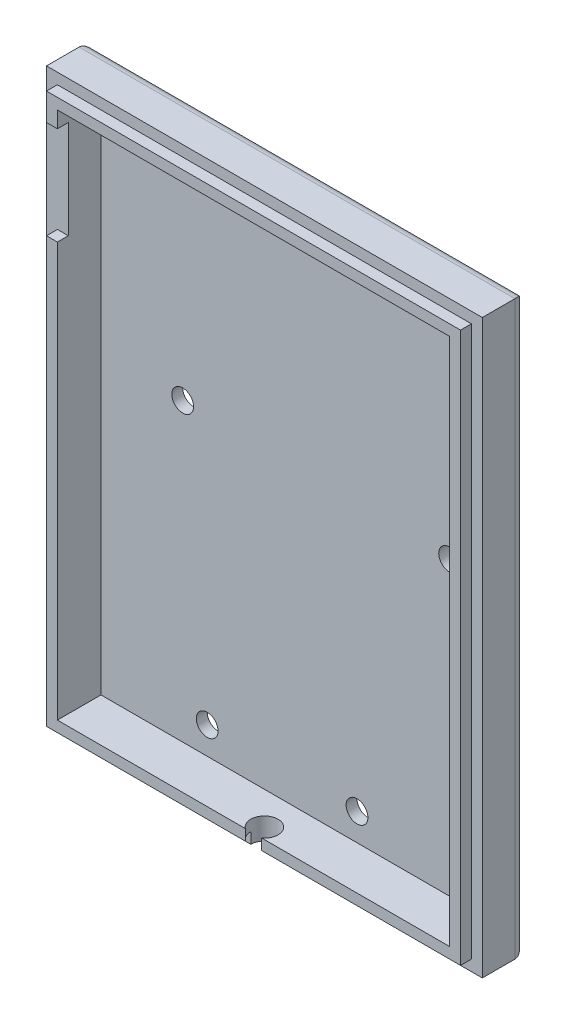
ISO-10303-21;
HEADER;
FILE_DESCRIPTION(('STEP AP214'),'2;1');
FILE_NAME('part.step','',(''),(''),'','','');
FILE_SCHEMA(('AUTOMOTIVE_DESIGN { 1 0 10303 214 1 1 1 1 }'));
ENDSEC;
DATA;
#1=APPLICATION_CONTEXT('core data for automotive mechanical design processes');
#2=APPLICATION_PROTOCOL_DEFINITION('international standard','automotive_design',2000,#1);
#3=PRODUCT_CONTEXT('',#1,'mechanical');
#4=PRODUCT('Part','Part','',(#3));
#5=PRODUCT_RELATED_PRODUCT_CATEGORY('part','',(#4));
#6=PRODUCT_DEFINITION_FORMATION('','',#4);
#7=PRODUCT_DEFINITION_CONTEXT('part definition',#1,'design');
#8=PRODUCT_DEFINITION('design','',#6,#7);
#9=PRODUCT_DEFINITION_SHAPE('','',#8);
#10=(LENGTH_UNIT() NAMED_UNIT(*) SI_UNIT(.MILLI.,.METRE.));
#11=(NAMED_UNIT(*) PLANE_ANGLE_UNIT() SI_UNIT($,.RADIAN.));
#12=(NAMED_UNIT(*) SI_UNIT($,.STERADIAN.) SOLID_ANGLE_UNIT());
#13=UNCERTAINTY_MEASURE_WITH_UNIT(LENGTH_MEASURE(1.E-05),#10,'distance_accuracy_value','');
#14=(GEOMETRIC_REPRESENTATION_CONTEXT(3) GLOBAL_UNCERTAINTY_ASSIGNED_CONTEXT((#13)) GLOBAL_UNIT_ASSIGNED_CONTEXT((#10,
#11,#12)) REPRESENTATION_CONTEXT('',''));
#15=CARTESIAN_POINT('',(0.,0.,0.));
#16=DIRECTION('',(0.,0.,1.));
#17=DIRECTION('',(1.,0.,0.));
#18=AXIS2_PLACEMENT_3D('',#15,#16,#17);
#19=CARTESIAN_POINT('',(-3.00000000000004,36.5344827586207,10.));
#20=DIRECTION('',(1.,0.,0.));
#21=DIRECTION('',(0.,1.,0.));
#22=AXIS2_PLACEMENT_3D('',#19,#20,#21);
#23=PLANE('',#22);
#24=DIRECTION('',(0.,-1.,0.));
#25=VECTOR('',#24,1.);
#26=CARTESIAN_POINT('',(-3.00000000000004,36.5344827586207,8.));
#27=LINE('',#26,#25);
#28=CARTESIAN_POINT('',(-3.00000000000004,36.5344827586207,8.));
#29=VERTEX_POINT('',#28);
#30=CARTESIAN_POINT('',(-3.00000000000004,31.5344827586207,8.));
#31=VERTEX_POINT('',#30);
#32=EDGE_CURVE('E215',#29,#31,#27,.T.);
#33=ORIENTED_EDGE('',*,*,#32,.T.);
#34=DIRECTION('',(0.,0.,1.));
#35=VECTOR('',#34,1.);
#36=CARTESIAN_POINT('',(-3.00000000000004,31.5344827586207,8.));
#37=LINE('',#36,#35);
#38=CARTESIAN_POINT('',(-3.00000000000004,31.5344827586207,10.));
#39=VERTEX_POINT('',#38);
#40=EDGE_CURVE('E374',#31,#39,#37,.T.);
#41=ORIENTED_EDGE('',*,*,#40,.T.);
#42=DIRECTION('',(0.,-1.,0.));
#43=VECTOR('',#42,1.);
#44=CARTESIAN_POINT('',(-3.00000000000004,36.5344827586207,10.));
#45=LINE('',#44,#43);
#46=CARTESIAN_POINT('',(-3.00000000000004,36.5344827586207,10.));
#47=VERTEX_POINT('',#46);
#48=EDGE_CURVE('E424',#47,#39,#45,.T.);
#49=ORIENTED_EDGE('',*,*,#48,.F.);
#50=DIRECTION('',(0.,0.,-1.));
#51=VECTOR('',#50,1.);
#52=CARTESIAN_POINT('',(-3.00000000000004,36.5344827586207,10.));
#53=LINE('',#52,#51);
#54=EDGE_CURVE('E238',#47,#29,#53,.T.);
#55=ORIENTED_EDGE('',*,*,#54,.T.);
#56=EDGE_LOOP('',(#33,#41,#49,#55));
#57=FACE_BOUND('',#56,.T.);
#58=ADVANCED_FACE('F39',(#57),#23,.F.);
#59=CARTESIAN_POINT('',(0.,0.,10.));
#60=DIRECTION('',(0.,0.,1.));
#61=DIRECTION('',(1.,0.,0.));
#62=AXIS2_PLACEMENT_3D('',#59,#60,#61);
#63=PLANE('',#62);
#64=DIRECTION('',(-1.,0.,0.));
#65=VECTOR('',#64,1.);
#66=CARTESIAN_POINT('',(-3.00000000000004,31.5344827586207,10.));
#67=LINE('',#66,#65);
#68=CARTESIAN_POINT('',(-1.00000000000004,31.5344827586207,10.));
#69=VERTEX_POINT('',#68);
#70=EDGE_CURVE('E197',#69,#39,#67,.T.);
#71=ORIENTED_EDGE('',*,*,#70,.F.);
#72=DIRECTION('',(0.,-1.,0.));
#73=VECTOR('',#72,1.);
#74=CARTESIAN_POINT('',(-1.00000000000004,34.5344827586207,10.));
#75=LINE('',#74,#73);
#76=CARTESIAN_POINT('',(-1.00000000000004,34.5344827586207,10.));
#77=VERTEX_POINT('',#76);
#78=EDGE_CURVE('E216',#77,#69,#75,.T.);
#79=ORIENTED_EDGE('',*,*,#78,.F.);
#80=DIRECTION('',(1.,0.,0.));
#81=VECTOR('',#80,1.);
#82=CARTESIAN_POINT('',(-1.00000000000004,34.5344827586207,10.));
#83=LINE('',#82,#81);
#84=CARTESIAN_POINT('',(71.,34.5344827586207,10.));
#85=VERTEX_POINT('',#84);
#86=EDGE_CURVE('E420',#77,#85,#83,.T.);
#87=ORIENTED_EDGE('',*,*,#86,.T.);
#88=DIRECTION('',(0.,-1.,0.));
#89=VECTOR('',#88,1.);
#90=CARTESIAN_POINT('',(71.,34.5344827586207,10.));
#91=LINE('',#90,#89);
#92=CARTESIAN_POINT('',(71.,-62.4655172413793,10.));
#93=VERTEX_POINT('',#92);
#94=EDGE_CURVE('E416',#85,#93,#91,.T.);
#95=ORIENTED_EDGE('',*,*,#94,.T.);
#96=DIRECTION('',(1.,0.,0.));
#97=VECTOR('',#96,1.);
#98=CARTESIAN_POINT('',(-1.00000000000003,-62.4655172413793,10.));
#99=LINE('',#98,#97);
#100=CARTESIAN_POINT('',(36.5,-62.4655172413793,10.));
#101=VERTEX_POINT('',#100);
#102=EDGE_CURVE('E411',#101,#93,#99,.T.);
#103=ORIENTED_EDGE('',*,*,#102,.F.);
#104=DIRECTION('',(0.,-1.,0.));
#105=VECTOR('',#104,1.);
#106=CARTESIAN_POINT('',(36.5,-61.4655172413793,10.));
#107=LINE('',#106,#105);
#108=CARTESIAN_POINT('',(36.5,-64.4655172413793,10.));
#109=VERTEX_POINT('',#108);
#110=EDGE_CURVE('E339',#109,#101,#107,.F.);
#111=ORIENTED_EDGE('',*,*,#110,.F.);
#112=DIRECTION('',(1.,0.,0.));
#113=VECTOR('',#112,1.);
#114=CARTESIAN_POINT('',(-3.00000000000003,-64.4655172413793,10.));
#115=LINE('',#114,#113);
#116=CARTESIAN_POINT('',(73.,-64.4655172413793,10.));
#117=VERTEX_POINT('',#116);
#118=EDGE_CURVE('E428',#109,#117,#115,.T.);
#119=ORIENTED_EDGE('',*,*,#118,.T.);
#120=DIRECTION('',(0.,1.,0.));
#121=VECTOR('',#120,1.);
#122=CARTESIAN_POINT('',(73.,36.5344827586207,10.));
#123=LINE('',#122,#121);
#124=CARTESIAN_POINT('',(73.,36.5344827586207,10.));
#125=VERTEX_POINT('',#124);
#126=EDGE_CURVE('E432',#117,#125,#123,.T.);
#127=ORIENTED_EDGE('',*,*,#126,.T.);
#128=DIRECTION('',(-1.,0.,0.));
#129=VECTOR('',#128,1.);
#130=CARTESIAN_POINT('',(-3.00000000000004,36.5344827586207,10.));
#131=LINE('',#130,#129);
#132=EDGE_CURVE('E227',#125,#47,#131,.T.);
#133=ORIENTED_EDGE('',*,*,#132,.T.);
#134=ORIENTED_EDGE('',*,*,#48,.T.);
#135=EDGE_LOOP('',(#71,#79,#87,#95,#103,#111,#119,#127,#133,#134));
#136=FACE_BOUND('',#135,.T.);
#137=ADVANCED_FACE('F441',(#136),#63,.T.);
#138=CARTESIAN_POINT('',(-3.00000000000003,-64.4655172413793,10.));
#139=DIRECTION('',(0.,1.,0.));
#140=DIRECTION('',(0.,0.,1.));
#141=AXIS2_PLACEMENT_3D('',#138,#139,#140);
#142=PLANE('',#141);
#143=ORIENTED_EDGE('',*,*,#118,.F.);
#144=CARTESIAN_POINT('',(35.,-64.4655172413793,8.));
#145=DIRECTION('',(0.,1.,0.));
#146=DIRECTION('',(0.,0.,1.));
#147=AXIS2_PLACEMENT_3D('',#144,#145,#146);
#148=CIRCLE('',#147,2.5);
#149=CARTESIAN_POINT('',(37.5,-64.4655172413793,8.));
#150=VERTEX_POINT('',#149);
#151=EDGE_CURVE('E390',#109,#150,#148,.T.);
#152=ORIENTED_EDGE('',*,*,#151,.T.);
#153=DIRECTION('',(1.,0.,0.));
#154=VECTOR('',#153,1.);
#155=CARTESIAN_POINT('',(-3.00000000000003,-64.4655172413793,8.));
#156=LINE('',#155,#154);
#157=CARTESIAN_POINT('',(73.,-64.4655172413793,8.));
#158=VERTEX_POINT('',#157);
#159=EDGE_CURVE('E221',#150,#158,#156,.T.);
#160=ORIENTED_EDGE('',*,*,#159,.T.);
#161=DIRECTION('',(0.,0.,-1.));
#162=VECTOR('',#161,1.);
#163=CARTESIAN_POINT('',(73.,-64.4655172413793,10.));
#164=LINE('',#163,#162);
#165=EDGE_CURVE('E245',#117,#158,#164,.T.);
#166=ORIENTED_EDGE('',*,*,#165,.F.);
#167=EDGE_LOOP('',(#143,#152,#160,#166));
#168=FACE_BOUND('',#167,.T.);
#169=ADVANCED_FACE('F483',(#168),#142,.F.);
#170=CARTESIAN_POINT('',(0.,0.,8.));
#171=DIRECTION('',(0.,0.,1.));
#172=DIRECTION('',(1.,0.,0.));
#173=AXIS2_PLACEMENT_3D('',#170,#171,#172);
#174=PLANE('',#173);
#175=DIRECTION('',(0.,-1.,0.));
#176=VECTOR('',#175,1.);
#177=CARTESIAN_POINT('',(32.5,-61.4655172413793,8.));
#178=LINE('',#177,#176);
#179=CARTESIAN_POINT('',(32.5,-64.4655172413793,8.));
#180=VERTEX_POINT('',#179);
#181=CARTESIAN_POINT('',(32.5,-66.4655172413793,8.));
#182=VERTEX_POINT('',#181);
#183=EDGE_CURVE('E408',#180,#182,#178,.T.);
#184=ORIENTED_EDGE('',*,*,#183,.F.);
#185=CARTESIAN_POINT('',(-3.00000000000003,-64.4655172413793,8.));
#186=VERTEX_POINT('',#185);
#187=EDGE_CURVE('E213',#186,#180,#156,.T.);
#188=ORIENTED_EDGE('',*,*,#187,.F.);
#189=CARTESIAN_POINT('',(-3.00000000000004,13.5344827586207,8.));
#190=VERTEX_POINT('',#189);
#191=EDGE_CURVE('E203',#190,#186,#27,.T.);
#192=ORIENTED_EDGE('',*,*,#191,.F.);
#193=DIRECTION('',(1.,0.,0.));
#194=VECTOR('',#193,1.);
#195=CARTESIAN_POINT('',(-3.00000000000004,13.5344827586207,8.));
#196=LINE('',#195,#194);
#197=CARTESIAN_POINT('',(-1.00000000000004,13.5344827586207,8.));
#198=VERTEX_POINT('',#197);
#199=EDGE_CURVE('E188',#190,#198,#196,.T.);
#200=ORIENTED_EDGE('',*,*,#199,.T.);
#201=DIRECTION('',(0.,1.,0.));
#202=VECTOR('',#201,1.);
#203=CARTESIAN_POINT('',(-1.00000000000004,31.5344827586207,8.));
#204=LINE('',#203,#202);
#205=CARTESIAN_POINT('',(-1.00000000000004,31.5344827586207,8.));
#206=VERTEX_POINT('',#205);
#207=EDGE_CURVE('E196',#198,#206,#204,.T.);
#208=ORIENTED_EDGE('',*,*,#207,.T.);
#209=DIRECTION('',(-1.,0.,0.));
#210=VECTOR('',#209,1.);
#211=CARTESIAN_POINT('',(-3.00000000000004,31.5344827586207,8.));
#212=LINE('',#211,#210);
#213=EDGE_CURVE('E207',#206,#31,#212,.T.);
#214=ORIENTED_EDGE('',*,*,#213,.T.);
#215=ORIENTED_EDGE('',*,*,#32,.F.);
#216=DIRECTION('',(-1.,0.,0.));
#217=VECTOR('',#216,1.);
#218=CARTESIAN_POINT('',(-3.00000000000004,36.5344827586207,8.));
#219=LINE('',#218,#217);
#220=CARTESIAN_POINT('',(73.,36.5344827586207,8.));
#221=VERTEX_POINT('',#220);
#222=EDGE_CURVE('E235',#221,#29,#219,.T.);
#223=ORIENTED_EDGE('',*,*,#222,.F.);
#224=DIRECTION('',(0.,1.,0.));
#225=VECTOR('',#224,1.);
#226=CARTESIAN_POINT('',(73.,36.5344827586207,8.));
#227=LINE('',#226,#225);
#228=EDGE_CURVE('E231',#158,#221,#227,.T.);
#229=ORIENTED_EDGE('',*,*,#228,.F.);
#230=ORIENTED_EDGE('',*,*,#159,.F.);
#231=DIRECTION('',(0.,-1.,0.));
#232=VECTOR('',#231,1.);
#233=CARTESIAN_POINT('',(37.5,-61.4655172413793,8.));
#234=LINE('',#233,#232);
#235=CARTESIAN_POINT('',(37.5,-66.4655172413793,8.));
#236=VERTEX_POINT('',#235);
#237=EDGE_CURVE('E405',#236,#150,#234,.F.);
#238=ORIENTED_EDGE('',*,*,#237,.F.);
#239=DIRECTION('',(1.,0.,0.));
#240=VECTOR('',#239,1.);
#241=CARTESIAN_POINT('',(0.,-66.4655172413793,8.));
#242=LINE('',#241,#240);
#243=CARTESIAN_POINT('',(75.,-66.4655172413793,8.));
#244=VERTEX_POINT('',#243);
#245=EDGE_CURVE('E306',#236,#244,#242,.T.);
#246=ORIENTED_EDGE('',*,*,#245,.T.);
#247=DIRECTION('',(0.,-1.,0.));
#248=VECTOR('',#247,1.);
#249=CARTESIAN_POINT('',(75.,0.,8.));
#250=LINE('',#249,#248);
#251=CARTESIAN_POINT('',(75.,38.5344827586207,8.));
#252=VERTEX_POINT('',#251);
#253=EDGE_CURVE('E294',#252,#244,#250,.T.);
#254=ORIENTED_EDGE('',*,*,#253,.F.);
#255=DIRECTION('',(1.,0.,0.));
#256=VECTOR('',#255,1.);
#257=CARTESIAN_POINT('',(0.,38.5344827586207,8.));
#258=LINE('',#257,#256);
#259=CARTESIAN_POINT('',(-5.00000000000004,38.5344827586207,8.));
#260=VERTEX_POINT('',#259);
#261=EDGE_CURVE('E298',#260,#252,#258,.T.);
#262=ORIENTED_EDGE('',*,*,#261,.F.);
#263=DIRECTION('',(0.,-1.,0.));
#264=VECTOR('',#263,1.);
#265=CARTESIAN_POINT('',(-5.00000000000004,0.,8.));
#266=LINE('',#265,#264);
#267=CARTESIAN_POINT('',(-5.00000000000003,-66.4655172413793,8.));
#268=VERTEX_POINT('',#267);
#269=EDGE_CURVE('E303',#260,#268,#266,.T.);
#270=ORIENTED_EDGE('',*,*,#269,.T.);
#271=EDGE_CURVE('E307',#268,#182,#242,.T.);
#272=ORIENTED_EDGE('',*,*,#271,.T.);
#273=EDGE_LOOP('',(#184,#188,#192,#200,#208,#214,#215,#223,#229,#230,#238,#246,#254,#262,#270,#272));
#274=FACE_BOUND('',#273,.T.);
#275=ADVANCED_FACE('F211',(#274),#174,.T.);
#276=CARTESIAN_POINT('',(75.,0.,8.));
#277=DIRECTION('',(1.,0.,0.));
#278=DIRECTION('',(0.,0.,-1.));
#279=AXIS2_PLACEMENT_3D('',#276,#277,#278);
#280=PLANE('',#279);
#281=DIRECTION('',(0.,0.,-1.));
#282=VECTOR('',#281,1.);
#283=CARTESIAN_POINT('',(75.,-66.4655172413793,8.));
#284=LINE('',#283,#282);
#285=CARTESIAN_POINT('',(75.,-66.4655172413793,2.));
#286=VERTEX_POINT('',#285);
#287=EDGE_CURVE('E311',#244,#286,#284,.T.);
#288=ORIENTED_EDGE('',*,*,#287,.T.);
#289=DIRECTION('',(0.,-1.,0.));
#290=VECTOR('',#289,1.);
#291=CARTESIAN_POINT('',(75.,38.5344827586207,2.));
#292=LINE('',#291,#290);
#293=CARTESIAN_POINT('',(75.,38.5344827586207,2.));
#294=VERTEX_POINT('',#293);
#295=EDGE_CURVE('E11',#286,#294,#292,.F.);
#296=ORIENTED_EDGE('',*,*,#295,.T.);
#297=DIRECTION('',(0.,0.,-1.));
#298=VECTOR('',#297,1.);
#299=CARTESIAN_POINT('',(75.,38.5344827586207,8.));
#300=LINE('',#299,#298);
#301=EDGE_CURVE('E336',#252,#294,#300,.T.);
#302=ORIENTED_EDGE('',*,*,#301,.F.);
#303=ORIENTED_EDGE('',*,*,#253,.T.);
#304=EDGE_LOOP('',(#288,#296,#302,#303));
#305=FACE_BOUND('',#304,.T.);
#306=ADVANCED_FACE('F556',(#305),#280,.T.);
#307=CARTESIAN_POINT('',(0.,38.5344827586207,8.));
#308=DIRECTION('',(0.,1.,0.));
#309=DIRECTION('',(0.,0.,1.));
#310=AXIS2_PLACEMENT_3D('',#307,#308,#309);
#311=PLANE('',#310);
#312=ORIENTED_EDGE('',*,*,#301,.T.);
#313=DIRECTION('',(1.,0.,0.));
#314=VECTOR('',#313,1.);
#315=CARTESIAN_POINT('',(-5.00000000000004,38.5344827586207,2.));
#316=LINE('',#315,#314);
#317=CARTESIAN_POINT('',(-5.00000000000004,38.5344827586207,2.));
#318=VERTEX_POINT('',#317);
#319=EDGE_CURVE('E49',#294,#318,#316,.F.);
#320=ORIENTED_EDGE('',*,*,#319,.T.);
#321=DIRECTION('',(0.,0.,-1.));
#322=VECTOR('',#321,1.);
#323=CARTESIAN_POINT('',(-5.00000000000004,38.5344827586207,8.));
#324=LINE('',#323,#322);
#325=EDGE_CURVE('E332',#260,#318,#324,.T.);
#326=ORIENTED_EDGE('',*,*,#325,.F.);
#327=ORIENTED_EDGE('',*,*,#261,.T.);
#328=EDGE_LOOP('',(#312,#320,#326,#327));
#329=FACE_BOUND('',#328,.T.);
#330=ADVANCED_FACE('F586',(#329),#311,.T.);
#331=CARTESIAN_POINT('',(-5.00000000000004,0.,8.));
#332=DIRECTION('',(1.,0.,0.));
#333=DIRECTION('',(0.,1.,0.));
#334=AXIS2_PLACEMENT_3D('',#331,#332,#333);
#335=PLANE('',#334);
#336=ORIENTED_EDGE('',*,*,#325,.T.);
#337=DIRECTION('',(0.,-1.,0.));
#338=VECTOR('',#337,1.);
#339=CARTESIAN_POINT('',(-5.00000000000004,0.,2.));
#340=LINE('',#339,#338);
#341=CARTESIAN_POINT('',(-5.00000000000003,-66.4655172413793,2.));
#342=VERTEX_POINT('',#341);
#343=EDGE_CURVE('E365',#318,#342,#340,.T.);
#344=ORIENTED_EDGE('',*,*,#343,.T.);
#345=DIRECTION('',(0.,0.,-1.));
#346=VECTOR('',#345,1.);
#347=CARTESIAN_POINT('',(-5.00000000000003,-66.4655172413793,8.));
#348=LINE('',#347,#346);
#349=EDGE_CURVE('E328',#268,#342,#348,.T.);
#350=ORIENTED_EDGE('',*,*,#349,.F.);
#351=ORIENTED_EDGE('',*,*,#269,.F.);
#352=EDGE_LOOP('',(#336,#344,#350,#351));
#353=FACE_BOUND('',#352,.T.);
#354=ADVANCED_FACE('F576',(#353),#335,.F.);
#355=CARTESIAN_POINT('',(46.,-57.4655172413793,8.));
#356=DIRECTION('',(0.,0.,-1.));
#357=DIRECTION('',(-1.,0.,0.));
#358=AXIS2_PLACEMENT_3D('',#355,#356,#357);
#359=CYLINDRICAL_SURFACE('',#358,2.);
#360=CARTESIAN_POINT('',(46.,-57.4655172413793,2.));
#361=DIRECTION('',(0.,0.,-1.));
#362=DIRECTION('',(-1.,0.,0.));
#363=AXIS2_PLACEMENT_3D('',#360,#361,#362);
#364=CIRCLE('',#363,2.);
#365=CARTESIAN_POINT('',(44.,-57.4655172413793,2.));
#366=VERTEX_POINT('',#365);
#367=EDGE_CURVE('E289',#366,#366,#364,.T.);
#368=ORIENTED_EDGE('',*,*,#367,.F.);
#369=EDGE_LOOP('',(#368));
#370=FACE_BOUND('',#369,.T.);
#371=CARTESIAN_POINT('',(46.,-57.4655172413793,0.));
#372=DIRECTION('',(0.,0.,1.));
#373=DIRECTION('',(1.,0.,0.));
#374=AXIS2_PLACEMENT_3D('',#371,#372,#373);
#375=CIRCLE('',#374,2.);
#376=CARTESIAN_POINT('',(48.,-57.4655172413793,0.));
#377=VERTEX_POINT('',#376);
#378=EDGE_CURVE('E319',#377,#377,#375,.T.);
#379=ORIENTED_EDGE('',*,*,#378,.F.);
#380=EDGE_LOOP('',(#379));
#381=FACE_BOUND('',#380,.T.);
#382=ADVANCED_FACE('F605',(#370,#381),#359,.F.);
#383=CARTESIAN_POINT('',(18.5,-57.4655172413793,8.));
#384=DIRECTION('',(0.,0.,-1.));
#385=DIRECTION('',(-1.,0.,0.));
#386=AXIS2_PLACEMENT_3D('',#383,#384,#385);
#387=CYLINDRICAL_SURFACE('',#386,2.);
#388=CARTESIAN_POINT('',(18.5,-57.4655172413793,2.));
#389=DIRECTION('',(0.,0.,-1.));
#390=DIRECTION('',(-1.,0.,0.));
#391=AXIS2_PLACEMENT_3D('',#388,#389,#390);
#392=CIRCLE('',#391,2.);
#393=CARTESIAN_POINT('',(16.5,-57.4655172413793,2.));
#394=VERTEX_POINT('',#393);
#395=EDGE_CURVE('E285',#394,#394,#392,.T.);
#396=ORIENTED_EDGE('',*,*,#395,.F.);
#397=EDGE_LOOP('',(#396));
#398=FACE_BOUND('',#397,.T.);
#399=CARTESIAN_POINT('',(18.5,-57.4655172413793,0.));
#400=DIRECTION('',(0.,0.,1.));
#401=DIRECTION('',(1.,0.,0.));
#402=AXIS2_PLACEMENT_3D('',#399,#400,#401);
#403=CIRCLE('',#402,2.);
#404=CARTESIAN_POINT('',(20.5,-57.4655172413793,0.));
#405=VERTEX_POINT('',#404);
#406=EDGE_CURVE('E315',#405,#405,#403,.T.);
#407=ORIENTED_EDGE('',*,*,#406,.F.);
#408=EDGE_LOOP('',(#407));
#409=FACE_BOUND('',#408,.T.);
#410=ADVANCED_FACE('F608',(#398,#409),#387,.F.);
#411=CARTESIAN_POINT('',(14.,-8.15057708828791,8.));
#412=DIRECTION('',(0.,0.,-1.));
#413=DIRECTION('',(-1.,0.,0.));
#414=AXIS2_PLACEMENT_3D('',#411,#412,#413);
#415=CYLINDRICAL_SURFACE('',#414,2.);
#416=CARTESIAN_POINT('',(14.,-8.15057708828791,2.));
#417=DIRECTION('',(0.,0.,-1.));
#418=DIRECTION('',(-1.,0.,0.));
#419=AXIS2_PLACEMENT_3D('',#416,#417,#418);
#420=CIRCLE('',#419,2.);
#421=CARTESIAN_POINT('',(12.,-8.15057708828791,2.));
#422=VERTEX_POINT('',#421);
#423=EDGE_CURVE('E281',#422,#422,#420,.T.);
#424=ORIENTED_EDGE('',*,*,#423,.F.);
#425=EDGE_LOOP('',(#424));
#426=FACE_BOUND('',#425,.T.);
#427=CARTESIAN_POINT('',(14.,-8.15057708828791,0.));
#428=DIRECTION('',(0.,0.,1.));
#429=DIRECTION('',(1.,0.,0.));
#430=AXIS2_PLACEMENT_3D('',#427,#428,#429);
#431=CIRCLE('',#430,2.);
#432=CARTESIAN_POINT('',(16.,-8.15057708828791,0.));
#433=VERTEX_POINT('',#432);
#434=EDGE_CURVE('E293',#433,#433,#431,.T.);
#435=ORIENTED_EDGE('',*,*,#434,.F.);
#436=EDGE_LOOP('',(#435));
#437=FACE_BOUND('',#436,.T.);
#438=ADVANCED_FACE('F612',(#426,#437),#415,.F.);
#439=CARTESIAN_POINT('',(0.,-66.4655172413793,8.));
#440=DIRECTION('',(0.,1.,0.));
#441=DIRECTION('',(0.,0.,1.));
#442=AXIS2_PLACEMENT_3D('',#439,#440,#441);
#443=PLANE('',#442);
#444=ORIENTED_EDGE('',*,*,#349,.T.);
#445=DIRECTION('',(1.,0.,0.));
#446=VECTOR('',#445,1.);
#447=CARTESIAN_POINT('',(0.,-66.4655172413793,2.));
#448=LINE('',#447,#446);
#449=EDGE_CURVE('E348',#342,#286,#448,.T.);
#450=ORIENTED_EDGE('',*,*,#449,.T.);
#451=ORIENTED_EDGE('',*,*,#287,.F.);
#452=ORIENTED_EDGE('',*,*,#245,.F.);
#453=CARTESIAN_POINT('',(35.,-66.4655172413793,8.));
#454=DIRECTION('',(0.,-1.,0.));
#455=DIRECTION('',(0.,0.,-1.));
#456=AXIS2_PLACEMENT_3D('',#453,#454,#455);
#457=CIRCLE('',#456,2.5);
#458=EDGE_CURVE('E384',#182,#236,#457,.T.);
#459=ORIENTED_EDGE('',*,*,#458,.F.);
#460=ORIENTED_EDGE('',*,*,#271,.F.);
#461=EDGE_LOOP('',(#444,#450,#451,#452,#459,#460));
#462=FACE_BOUND('',#461,.T.);
#463=ADVANCED_FACE('F580',(#462),#443,.F.);
#464=CARTESIAN_POINT('',(62.9999999999999,-8.95057708828791,8.));
#465=DIRECTION('',(0.,0.,-1.));
#466=DIRECTION('',(-1.,0.,0.));
#467=AXIS2_PLACEMENT_3D('',#464,#465,#466);
#468=CYLINDRICAL_SURFACE('',#467,2.);
#469=CARTESIAN_POINT('',(62.9999999999999,-8.95057708828791,2.));
#470=DIRECTION('',(0.,0.,-1.));
#471=DIRECTION('',(-1.,0.,0.));
#472=AXIS2_PLACEMENT_3D('',#469,#470,#471);
#473=CIRCLE('',#472,2.);
#474=CARTESIAN_POINT('',(61.,-8.95057708828791,2.));
#475=VERTEX_POINT('',#474);
#476=EDGE_CURVE('E271',#475,#475,#473,.T.);
#477=ORIENTED_EDGE('',*,*,#476,.F.);
#478=EDGE_LOOP('',(#477));
#479=FACE_BOUND('',#478,.T.);
#480=CARTESIAN_POINT('',(62.9999999999999,-8.95057708828791,0.));
#481=DIRECTION('',(0.,0.,1.));
#482=DIRECTION('',(1.,0.,0.));
#483=AXIS2_PLACEMENT_3D('',#480,#481,#482);
#484=CIRCLE('',#483,2.);
#485=CARTESIAN_POINT('',(64.9999999999999,-8.95057708828791,0.));
#486=VERTEX_POINT('',#485);
#487=EDGE_CURVE('E299',#486,#486,#484,.T.);
#488=ORIENTED_EDGE('',*,*,#487,.F.);
#489=EDGE_LOOP('',(#488));
#490=FACE_BOUND('',#489,.T.);
#491=ADVANCED_FACE('F601',(#479,#490),#468,.F.);
#492=CARTESIAN_POINT('',(0.,0.,0.));
#493=DIRECTION('',(0.,0.,1.));
#494=DIRECTION('',(1.,0.,0.));
#495=AXIS2_PLACEMENT_3D('',#492,#493,#494);
#496=PLANE('',#495);
#497=DIRECTION('',(0.,-1.,0.));
#498=VECTOR('',#497,1.);
#499=CARTESIAN_POINT('',(73.,-66.4655172413793,0.));
#500=LINE('',#499,#498);
#501=CARTESIAN_POINT('',(73.,36.5344827586207,0.));
#502=VERTEX_POINT('',#501);
#503=CARTESIAN_POINT('',(73.,-64.4655172413793,0.));
#504=VERTEX_POINT('',#503);
#505=EDGE_CURVE('E352',#502,#504,#500,.T.);
#506=ORIENTED_EDGE('',*,*,#505,.T.);
#507=DIRECTION('',(1.,0.,0.));
#508=VECTOR('',#507,1.);
#509=CARTESIAN_POINT('',(0.,-64.4655172413793,0.));
#510=LINE('',#509,#508);
#511=CARTESIAN_POINT('',(-3.00000000000003,-64.4655172413793,0.));
#512=VERTEX_POINT('',#511);
#513=EDGE_CURVE('E361',#504,#512,#510,.F.);
#514=ORIENTED_EDGE('',*,*,#513,.T.);
#515=DIRECTION('',(0.,-1.,0.));
#516=VECTOR('',#515,1.);
#517=CARTESIAN_POINT('',(-3.00000000000004,0.,0.));
#518=LINE('',#517,#516);
#519=CARTESIAN_POINT('',(-3.00000000000004,36.5344827586207,0.));
#520=VERTEX_POINT('',#519);
#521=EDGE_CURVE('E358',#512,#520,#518,.F.);
#522=ORIENTED_EDGE('',*,*,#521,.T.);
#523=DIRECTION('',(1.,0.,0.));
#524=VECTOR('',#523,1.);
#525=CARTESIAN_POINT('',(75.,36.5344827586207,0.));
#526=LINE('',#525,#524);
#527=EDGE_CURVE('E355',#520,#502,#526,.T.);
#528=ORIENTED_EDGE('',*,*,#527,.T.);
#529=EDGE_LOOP('',(#506,#514,#522,#528));
#530=FACE_BOUND('',#529,.T.);
#531=ORIENTED_EDGE('',*,*,#434,.T.);
#532=EDGE_LOOP('',(#531));
#533=FACE_BOUND('',#532,.T.);
#534=ORIENTED_EDGE('',*,*,#406,.T.);
#535=EDGE_LOOP('',(#534));
#536=FACE_BOUND('',#535,.T.);
#537=ORIENTED_EDGE('',*,*,#378,.T.);
#538=EDGE_LOOP('',(#537));
#539=FACE_BOUND('',#538,.T.);
#540=ORIENTED_EDGE('',*,*,#487,.T.);
#541=EDGE_LOOP('',(#540));
#542=FACE_BOUND('',#541,.T.);
#543=ADVANCED_FACE('F570',(#530,#533,#536,#539,#542),#496,.F.);
#544=CARTESIAN_POINT('',(-1.00000000000003,-62.4655172413793,2.));
#545=DIRECTION('',(0.,-1.,0.));
#546=DIRECTION('',(0.,0.,-1.));
#547=AXIS2_PLACEMENT_3D('',#544,#545,#546);
#548=PLANE('',#547);
#549=CARTESIAN_POINT('',(-1.00000000000003,-62.4655172413793,10.));
#550=VERTEX_POINT('',#549);
#551=CARTESIAN_POINT('',(33.5,-62.4655172413793,10.));
#552=VERTEX_POINT('',#551);
#553=EDGE_CURVE('E412',#550,#552,#99,.T.);
#554=ORIENTED_EDGE('',*,*,#553,.T.);
#555=CARTESIAN_POINT('',(35.,-62.4655172413793,8.));
#556=DIRECTION('',(0.,-1.,0.));
#557=DIRECTION('',(0.,0.,-1.));
#558=AXIS2_PLACEMENT_3D('',#555,#556,#557);
#559=CIRCLE('',#558,2.5);
#560=EDGE_CURVE('E397',#552,#101,#559,.T.);
#561=ORIENTED_EDGE('',*,*,#560,.T.);
#562=ORIENTED_EDGE('',*,*,#102,.T.);
#563=DIRECTION('',(0.,0.,1.));
#564=VECTOR('',#563,1.);
#565=CARTESIAN_POINT('',(71.,-62.4655172413793,2.));
#566=LINE('',#565,#564);
#567=CARTESIAN_POINT('',(71.,-62.4655172413793,2.));
#568=VERTEX_POINT('',#567);
#569=EDGE_CURVE('E266',#568,#93,#566,.T.);
#570=ORIENTED_EDGE('',*,*,#569,.F.);
#571=DIRECTION('',(1.,0.,0.));
#572=VECTOR('',#571,1.);
#573=CARTESIAN_POINT('',(-1.00000000000003,-62.4655172413793,2.));
#574=LINE('',#573,#572);
#575=CARTESIAN_POINT('',(-1.00000000000003,-62.4655172413793,2.));
#576=VERTEX_POINT('',#575);
#577=EDGE_CURVE('E252',#576,#568,#574,.T.);
#578=ORIENTED_EDGE('',*,*,#577,.F.);
#579=DIRECTION('',(0.,0.,1.));
#580=VECTOR('',#579,1.);
#581=CARTESIAN_POINT('',(-1.00000000000003,-62.4655172413793,2.));
#582=LINE('',#581,#580);
#583=EDGE_CURVE('E267',#576,#550,#582,.T.);
#584=ORIENTED_EDGE('',*,*,#583,.T.);
#585=EDGE_LOOP('',(#554,#561,#562,#570,#578,#584));
#586=FACE_BOUND('',#585,.T.);
#587=ADVANCED_FACE('F510',(#586),#548,.F.);
#588=CARTESIAN_POINT('',(-1.00000000000004,34.5344827586207,2.));
#589=DIRECTION('',(-1.,0.,0.));
#590=DIRECTION('',(0.,-1.,0.));
#591=AXIS2_PLACEMENT_3D('',#588,#589,#590);
#592=PLANE('',#591);
#593=ORIENTED_EDGE('',*,*,#78,.T.);
#594=DIRECTION('',(0.,0.,1.));
#595=VECTOR('',#594,1.);
#596=CARTESIAN_POINT('',(-1.00000000000004,31.5344827586207,8.));
#597=LINE('',#596,#595);
#598=EDGE_CURVE('E453',#206,#69,#597,.T.);
#599=ORIENTED_EDGE('',*,*,#598,.F.);
#600=ORIENTED_EDGE('',*,*,#207,.F.);
#601=DIRECTION('',(0.,0.,1.));
#602=VECTOR('',#601,1.);
#603=CARTESIAN_POINT('',(-1.00000000000004,13.5344827586207,8.));
#604=LINE('',#603,#602);
#605=CARTESIAN_POINT('',(-1.00000000000004,13.5344827586207,10.));
#606=VERTEX_POINT('',#605);
#607=EDGE_CURVE('E191',#198,#606,#604,.T.);
#608=ORIENTED_EDGE('',*,*,#607,.T.);
#609=EDGE_CURVE('E223',#606,#550,#75,.T.);
#610=ORIENTED_EDGE('',*,*,#609,.T.);
#611=ORIENTED_EDGE('',*,*,#583,.F.);
#612=DIRECTION('',(0.,-1.,0.));
#613=VECTOR('',#612,1.);
#614=CARTESIAN_POINT('',(-1.00000000000004,34.5344827586207,2.));
#615=LINE('',#614,#613);
#616=CARTESIAN_POINT('',(-1.00000000000004,34.5344827586207,2.));
#617=VERTEX_POINT('',#616);
#618=EDGE_CURVE('E262',#617,#576,#615,.T.);
#619=ORIENTED_EDGE('',*,*,#618,.F.);
#620=DIRECTION('',(0.,0.,1.));
#621=VECTOR('',#620,1.);
#622=CARTESIAN_POINT('',(-1.00000000000004,34.5344827586207,2.));
#623=LINE('',#622,#621);
#624=EDGE_CURVE('E272',#617,#77,#623,.T.);
#625=ORIENTED_EDGE('',*,*,#624,.T.);
#626=EDGE_LOOP('',(#593,#599,#600,#608,#610,#611,#619,#625));
#627=FACE_BOUND('',#626,.T.);
#628=ADVANCED_FACE('F462',(#627),#592,.F.);
#629=CARTESIAN_POINT('',(-1.00000000000004,34.5344827586207,2.));
#630=DIRECTION('',(0.,-1.,0.));
#631=DIRECTION('',(0.,0.,-1.));
#632=AXIS2_PLACEMENT_3D('',#629,#630,#631);
#633=PLANE('',#632);
#634=DIRECTION('',(0.,0.,1.));
#635=VECTOR('',#634,1.);
#636=CARTESIAN_POINT('',(71.,34.5344827586207,2.));
#637=LINE('',#636,#635);
#638=CARTESIAN_POINT('',(71.,34.5344827586207,2.));
#639=VERTEX_POINT('',#638);
#640=EDGE_CURVE('E275',#639,#85,#637,.T.);
#641=ORIENTED_EDGE('',*,*,#640,.T.);
#642=ORIENTED_EDGE('',*,*,#86,.F.);
#643=ORIENTED_EDGE('',*,*,#624,.F.);
#644=DIRECTION('',(1.,0.,0.));
#645=VECTOR('',#644,1.);
#646=CARTESIAN_POINT('',(-1.00000000000004,34.5344827586207,2.));
#647=LINE('',#646,#645);
#648=EDGE_CURVE('E259',#617,#639,#647,.T.);
#649=ORIENTED_EDGE('',*,*,#648,.T.);
#650=EDGE_LOOP('',(#641,#642,#643,#649));
#651=FACE_BOUND('',#650,.T.);
#652=ADVANCED_FACE('F499',(#651),#633,.T.);
#653=CARTESIAN_POINT('',(71.,34.5344827586207,2.));
#654=DIRECTION('',(-1.,0.,0.));
#655=DIRECTION('',(0.,-1.,0.));
#656=AXIS2_PLACEMENT_3D('',#653,#654,#655);
#657=PLANE('',#656);
#658=ORIENTED_EDGE('',*,*,#569,.T.);
#659=ORIENTED_EDGE('',*,*,#94,.F.);
#660=ORIENTED_EDGE('',*,*,#640,.F.);
#661=DIRECTION('',(0.,-1.,0.));
#662=VECTOR('',#661,1.);
#663=CARTESIAN_POINT('',(71.,34.5344827586207,2.));
#664=LINE('',#663,#662);
#665=EDGE_CURVE('E256',#639,#568,#664,.T.);
#666=ORIENTED_EDGE('',*,*,#665,.T.);
#667=EDGE_LOOP('',(#658,#659,#660,#666));
#668=FACE_BOUND('',#667,.T.);
#669=ADVANCED_FACE('F505',(#668),#657,.T.);
#670=CARTESIAN_POINT('',(0.,0.,2.));
#671=DIRECTION('',(0.,0.,-1.));
#672=DIRECTION('',(-1.,0.,0.));
#673=AXIS2_PLACEMENT_3D('',#670,#671,#672);
#674=PLANE('',#673);
#675=ORIENTED_EDGE('',*,*,#367,.T.);
#676=EDGE_LOOP('',(#675));
#677=FACE_BOUND('',#676,.T.);
#678=ORIENTED_EDGE('',*,*,#395,.T.);
#679=EDGE_LOOP('',(#678));
#680=FACE_BOUND('',#679,.T.);
#681=ORIENTED_EDGE('',*,*,#423,.T.);
#682=EDGE_LOOP('',(#681));
#683=FACE_BOUND('',#682,.T.);
#684=ORIENTED_EDGE('',*,*,#476,.T.);
#685=EDGE_LOOP('',(#684));
#686=FACE_BOUND('',#685,.T.);
#687=ORIENTED_EDGE('',*,*,#577,.T.);
#688=ORIENTED_EDGE('',*,*,#665,.F.);
#689=ORIENTED_EDGE('',*,*,#648,.F.);
#690=ORIENTED_EDGE('',*,*,#618,.T.);
#691=EDGE_LOOP('',(#687,#688,#689,#690));
#692=FACE_BOUND('',#691,.T.);
#693=ADVANCED_FACE('F512',(#677,#680,#683,#686,#692),#674,.F.);
#694=CARTESIAN_POINT('',(-3.00000000000004,13.5344827586207,10.));
#695=VERTEX_POINT('',#694);
#696=CARTESIAN_POINT('',(-3.00000000000003,-64.4655172413793,10.));
#697=VERTEX_POINT('',#696);
#698=EDGE_CURVE('E205',#695,#697,#45,.T.);
#699=ORIENTED_EDGE('',*,*,#698,.F.);
#700=DIRECTION('',(0.,0.,1.));
#701=VECTOR('',#700,1.);
#702=CARTESIAN_POINT('',(-3.00000000000004,13.5344827586207,8.));
#703=LINE('',#702,#701);
#704=EDGE_CURVE('E57',#190,#695,#703,.T.);
#705=ORIENTED_EDGE('',*,*,#704,.F.);
#706=ORIENTED_EDGE('',*,*,#191,.T.);
#707=DIRECTION('',(0.,0.,-1.));
#708=VECTOR('',#707,1.);
#709=CARTESIAN_POINT('',(-3.00000000000003,-64.4655172413793,10.));
#710=LINE('',#709,#708);
#711=EDGE_CURVE('E249',#697,#186,#710,.T.);
#712=ORIENTED_EDGE('',*,*,#711,.F.);
#713=EDGE_LOOP('',(#699,#705,#706,#712));
#714=FACE_BOUND('',#713,.T.);
#715=ADVANCED_FACE('F201',(#714),#23,.F.);
#716=ORIENTED_EDGE('',*,*,#187,.T.);
#717=CARTESIAN_POINT('',(33.5,-64.4655172413793,10.));
#718=VERTEX_POINT('',#717);
#719=EDGE_CURVE('E399',#180,#718,#148,.T.);
#720=ORIENTED_EDGE('',*,*,#719,.T.);
#721=EDGE_CURVE('E429',#697,#718,#115,.T.);
#722=ORIENTED_EDGE('',*,*,#721,.F.);
#723=ORIENTED_EDGE('',*,*,#711,.T.);
#724=EDGE_LOOP('',(#716,#720,#722,#723));
#725=FACE_BOUND('',#724,.T.);
#726=ADVANCED_FACE('F475',(#725),#142,.F.);
#727=CARTESIAN_POINT('',(73.,36.5344827586207,10.));
#728=DIRECTION('',(-1.,0.,0.));
#729=DIRECTION('',(0.,-1.,0.));
#730=AXIS2_PLACEMENT_3D('',#727,#728,#729);
#731=PLANE('',#730);
#732=ORIENTED_EDGE('',*,*,#228,.T.);
#733=DIRECTION('',(0.,0.,-1.));
#734=VECTOR('',#733,1.);
#735=CARTESIAN_POINT('',(73.,36.5344827586207,10.));
#736=LINE('',#735,#734);
#737=EDGE_CURVE('E242',#125,#221,#736,.T.);
#738=ORIENTED_EDGE('',*,*,#737,.F.);
#739=ORIENTED_EDGE('',*,*,#126,.F.);
#740=ORIENTED_EDGE('',*,*,#165,.T.);
#741=EDGE_LOOP('',(#732,#738,#739,#740));
#742=FACE_BOUND('',#741,.T.);
#743=ADVANCED_FACE('F486',(#742),#731,.F.);
#744=CARTESIAN_POINT('',(-3.00000000000004,36.5344827586207,10.));
#745=DIRECTION('',(0.,-1.,0.));
#746=DIRECTION('',(0.,0.,-1.));
#747=AXIS2_PLACEMENT_3D('',#744,#745,#746);
#748=PLANE('',#747);
#749=ORIENTED_EDGE('',*,*,#222,.T.);
#750=ORIENTED_EDGE('',*,*,#54,.F.);
#751=ORIENTED_EDGE('',*,*,#132,.F.);
#752=ORIENTED_EDGE('',*,*,#737,.T.);
#753=EDGE_LOOP('',(#749,#750,#751,#752));
#754=FACE_BOUND('',#753,.T.);
#755=ADVANCED_FACE('F444',(#754),#748,.F.);
#756=DIRECTION('',(1.,0.,0.));
#757=VECTOR('',#756,1.);
#758=CARTESIAN_POINT('',(-3.00000000000004,13.5344827586207,10.));
#759=LINE('',#758,#757);
#760=EDGE_CURVE('E467',#695,#606,#759,.T.);
#761=ORIENTED_EDGE('',*,*,#760,.F.);
#762=ORIENTED_EDGE('',*,*,#698,.T.);
#763=ORIENTED_EDGE('',*,*,#721,.T.);
#764=DIRECTION('',(0.,-1.,0.));
#765=VECTOR('',#764,1.);
#766=CARTESIAN_POINT('',(33.5,-61.4655172413793,10.));
#767=LINE('',#766,#765);
#768=EDGE_CURVE('E345',#552,#718,#767,.T.);
#769=ORIENTED_EDGE('',*,*,#768,.F.);
#770=ORIENTED_EDGE('',*,*,#553,.F.);
#771=ORIENTED_EDGE('',*,*,#609,.F.);
#772=EDGE_LOOP('',(#761,#762,#763,#769,#770,#771));
#773=FACE_BOUND('',#772,.T.);
#774=ADVANCED_FACE('F466',(#773),#63,.T.);
#775=CARTESIAN_POINT('',(35.,-61.4655172413793,8.));
#776=DIRECTION('',(0.,-1.,0.));
#777=DIRECTION('',(0.,0.,-1.));
#778=AXIS2_PLACEMENT_3D('',#775,#776,#777);
#779=CYLINDRICAL_SURFACE('',#778,2.5);
#780=ORIENTED_EDGE('',*,*,#183,.T.);
#781=ORIENTED_EDGE('',*,*,#458,.T.);
#782=ORIENTED_EDGE('',*,*,#237,.T.);
#783=ORIENTED_EDGE('',*,*,#151,.F.);
#784=ORIENTED_EDGE('',*,*,#110,.T.);
#785=ORIENTED_EDGE('',*,*,#560,.F.);
#786=ORIENTED_EDGE('',*,*,#768,.T.);
#787=ORIENTED_EDGE('',*,*,#719,.F.);
#788=EDGE_LOOP('',(#780,#781,#782,#783,#784,#785,#786,#787));
#789=FACE_BOUND('',#788,.T.);
#790=ADVANCED_FACE('F537',(#789),#779,.F.);
#791=CARTESIAN_POINT('',(0.,36.5344827586207,2.));
#792=DIRECTION('',(-1.,0.,0.));
#793=DIRECTION('',(0.,0.,1.));
#794=AXIS2_PLACEMENT_3D('',#791,#792,#793);
#795=CYLINDRICAL_SURFACE('',#794,2.);
#796=CARTESIAN_POINT('',(73.,36.5344827586207,2.));
#797=DIRECTION('',(-0.707106781186547,0.707106781186547,0.));
#798=DIRECTION('',(0.707106781186547,0.707106781186547,0.));
#799=AXIS2_PLACEMENT_3D('',#796,#797,#798);
#800=ELLIPSE('',#799,2.82842712474619,2.);
#801=EDGE_CURVE('E376',#502,#294,#800,.F.);
#802=ORIENTED_EDGE('',*,*,#801,.F.);
#803=ORIENTED_EDGE('',*,*,#527,.F.);
#804=CARTESIAN_POINT('',(-3.00000000000004,36.5344827586207,2.));
#805=DIRECTION('',(-0.707106781186547,-0.707106781186548,0.));
#806=DIRECTION('',(-0.707106781186547,0.707106781186547,0.));
#807=AXIS2_PLACEMENT_3D('',#804,#805,#806);
#808=ELLIPSE('',#807,2.82842712474619,2.);
#809=EDGE_CURVE('E43',#318,#520,#808,.T.);
#810=ORIENTED_EDGE('',*,*,#809,.F.);
#811=ORIENTED_EDGE('',*,*,#319,.F.);
#812=EDGE_LOOP('',(#802,#803,#810,#811));
#813=FACE_BOUND('',#812,.T.);
#814=ADVANCED_FACE('F41',(#813),#795,.T.);
#815=CARTESIAN_POINT('',(-3.00000000000004,0.,2.));
#816=DIRECTION('',(0.,-1.,0.));
#817=DIRECTION('',(1.,0.,0.));
#818=AXIS2_PLACEMENT_3D('',#815,#816,#817);
#819=CYLINDRICAL_SURFACE('',#818,2.);
#820=ORIENTED_EDGE('',*,*,#809,.T.);
#821=ORIENTED_EDGE('',*,*,#521,.F.);
#822=CARTESIAN_POINT('',(-3.00000000000003,-64.4655172413793,2.));
#823=DIRECTION('',(0.707106781186547,-0.707106781186547,0.));
#824=DIRECTION('',(-0.707106781186547,-0.707106781186548,0.));
#825=AXIS2_PLACEMENT_3D('',#822,#823,#824);
#826=ELLIPSE('',#825,2.82842712474619,2.);
#827=EDGE_CURVE('E373',#342,#512,#826,.T.);
#828=ORIENTED_EDGE('',*,*,#827,.F.);
#829=ORIENTED_EDGE('',*,*,#343,.F.);
#830=EDGE_LOOP('',(#820,#821,#828,#829));
#831=FACE_BOUND('',#830,.T.);
#832=ADVANCED_FACE('F553',(#831),#819,.T.);
#833=CARTESIAN_POINT('',(73.,0.,2.));
#834=DIRECTION('',(0.,1.,0.));
#835=DIRECTION('',(0.,0.,1.));
#836=AXIS2_PLACEMENT_3D('',#833,#834,#835);
#837=CYLINDRICAL_SURFACE('',#836,2.);
#838=ORIENTED_EDGE('',*,*,#801,.T.);
#839=ORIENTED_EDGE('',*,*,#295,.F.);
#840=CARTESIAN_POINT('',(73.,-64.4655172413793,2.));
#841=DIRECTION('',(0.707106781186547,0.707106781186547,0.));
#842=DIRECTION('',(-0.707106781186547,0.707106781186547,0.));
#843=AXIS2_PLACEMENT_3D('',#840,#841,#842);
#844=ELLIPSE('',#843,2.82842712474619,2.);
#845=EDGE_CURVE('E370',#504,#286,#844,.F.);
#846=ORIENTED_EDGE('',*,*,#845,.F.);
#847=ORIENTED_EDGE('',*,*,#505,.F.);
#848=EDGE_LOOP('',(#838,#839,#846,#847));
#849=FACE_BOUND('',#848,.T.);
#850=ADVANCED_FACE('F547',(#849),#837,.T.);
#851=CARTESIAN_POINT('',(0.,-64.4655172413793,2.));
#852=DIRECTION('',(1.,0.,0.));
#853=DIRECTION('',(0.,0.,-1.));
#854=AXIS2_PLACEMENT_3D('',#851,#852,#853);
#855=CYLINDRICAL_SURFACE('',#854,2.);
#856=ORIENTED_EDGE('',*,*,#827,.T.);
#857=ORIENTED_EDGE('',*,*,#513,.F.);
#858=ORIENTED_EDGE('',*,*,#845,.T.);
#859=ORIENTED_EDGE('',*,*,#449,.F.);
#860=EDGE_LOOP('',(#856,#857,#858,#859));
#861=FACE_BOUND('',#860,.T.);
#862=ADVANCED_FACE('F543',(#861),#855,.T.);
#863=CARTESIAN_POINT('',(-3.00000000000004,31.5344827586207,8.));
#864=DIRECTION('',(0.,1.,0.));
#865=DIRECTION('',(0.,0.,1.));
#866=AXIS2_PLACEMENT_3D('',#863,#864,#865);
#867=PLANE('',#866);
#868=ORIENTED_EDGE('',*,*,#70,.T.);
#869=ORIENTED_EDGE('',*,*,#40,.F.);
#870=ORIENTED_EDGE('',*,*,#213,.F.);
#871=ORIENTED_EDGE('',*,*,#598,.T.);
#872=EDGE_LOOP('',(#868,#869,#870,#871));
#873=FACE_BOUND('',#872,.T.);
#874=ADVANCED_FACE('F493',(#873),#867,.F.);
#875=CARTESIAN_POINT('',(-3.00000000000004,13.5344827586207,8.));
#876=DIRECTION('',(0.,-1.,0.));
#877=DIRECTION('',(0.,0.,-1.));
#878=AXIS2_PLACEMENT_3D('',#875,#876,#877);
#879=PLANE('',#878);
#880=ORIENTED_EDGE('',*,*,#760,.T.);
#881=ORIENTED_EDGE('',*,*,#607,.F.);
#882=ORIENTED_EDGE('',*,*,#199,.F.);
#883=ORIENTED_EDGE('',*,*,#704,.T.);
#884=EDGE_LOOP('',(#880,#881,#882,#883));
#885=FACE_BOUND('',#884,.T.);
#886=ADVANCED_FACE('F189',(#885),#879,.F.);
#887=CLOSED_SHELL('',(#58,#137,#169,#275,#306,#330,#354,#382,#410,#438,#463,#491,#543,#587,#628,
#652,#669,#693,#715,#726,#743,#755,#774,#790,#814,#832,#850,#862,#874,#886));
#888=MANIFOLD_SOLID_BREP('B2',#887);
#889=ADVANCED_BREP_SHAPE_REPRESENTATION('',(#18,#888),#14);
#890=SHAPE_DEFINITION_REPRESENTATION(#9,#889);
ENDSEC;
END-ISO-10303-21;
